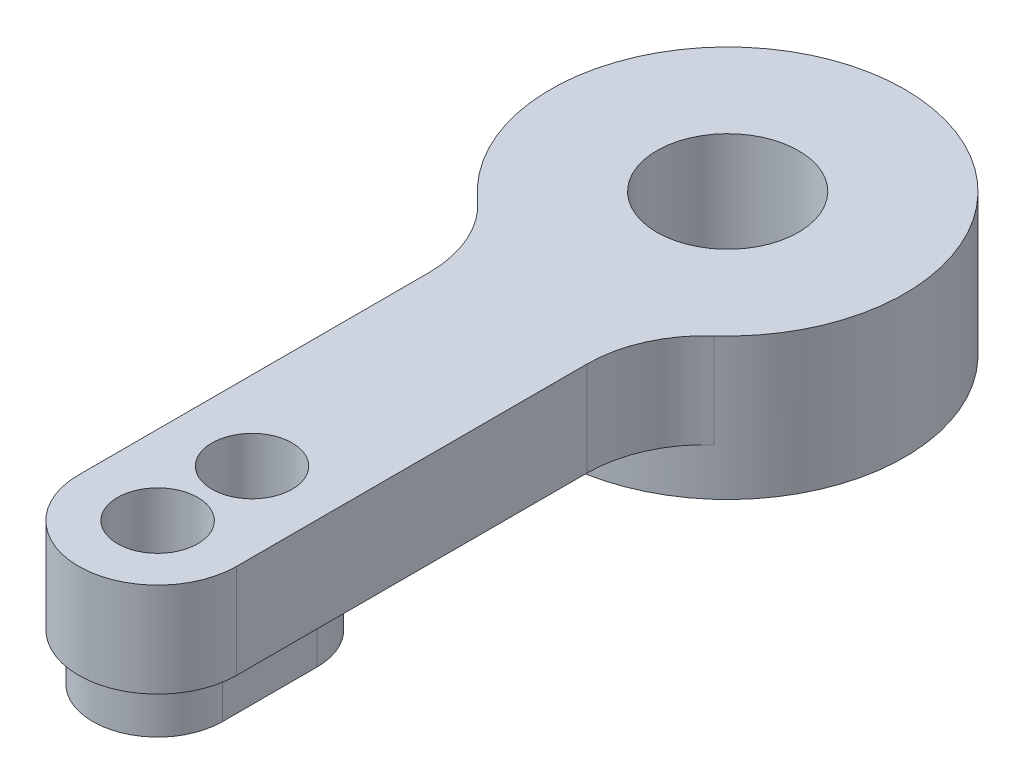
ISO-10303-21;
HEADER;
FILE_DESCRIPTION(('STEP AP214'),'2;1');
FILE_NAME('part.step','',(''),(''),'','','');
FILE_SCHEMA(('AUTOMOTIVE_DESIGN { 1 0 10303 214 1 1 1 1 }'));
ENDSEC;
DATA;
#1=APPLICATION_CONTEXT('core data for automotive mechanical design processes');
#2=APPLICATION_PROTOCOL_DEFINITION('international standard','automotive_design',2000,#1);
#3=PRODUCT_CONTEXT('',#1,'mechanical');
#4=PRODUCT('Part','Part','',(#3));
#5=PRODUCT_RELATED_PRODUCT_CATEGORY('part','',(#4));
#6=PRODUCT_DEFINITION_FORMATION('','',#4);
#7=PRODUCT_DEFINITION_CONTEXT('part definition',#1,'design');
#8=PRODUCT_DEFINITION('design','',#6,#7);
#9=PRODUCT_DEFINITION_SHAPE('','',#8);
#10=(LENGTH_UNIT() NAMED_UNIT(*) SI_UNIT(.MILLI.,.METRE.));
#11=(NAMED_UNIT(*) PLANE_ANGLE_UNIT() SI_UNIT($,.RADIAN.));
#12=(NAMED_UNIT(*) SI_UNIT($,.STERADIAN.) SOLID_ANGLE_UNIT());
#13=UNCERTAINTY_MEASURE_WITH_UNIT(LENGTH_MEASURE(1.E-05),#10,'distance_accuracy_value','');
#14=(GEOMETRIC_REPRESENTATION_CONTEXT(3) GLOBAL_UNCERTAINTY_ASSIGNED_CONTEXT((#13)) GLOBAL_UNIT_ASSIGNED_CONTEXT((#10,
#11,#12)) REPRESENTATION_CONTEXT('',''));
#15=CARTESIAN_POINT('',(0.,0.,0.));
#16=DIRECTION('',(0.,0.,1.));
#17=DIRECTION('',(1.,0.,0.));
#18=AXIS2_PLACEMENT_3D('',#15,#16,#17);
#19=CARTESIAN_POINT('',(0.,0.,24.15));
#20=DIRECTION('',(0.,1.,0.));
#21=DIRECTION('',(0.,0.,1.));
#22=AXIS2_PLACEMENT_3D('',#19,#20,#21);
#23=PLANE('',#22);
#24=CARTESIAN_POINT('',(0.,0.,20.15));
#25=DIRECTION('',(0.,-1.,0.));
#26=DIRECTION('',(0.,0.,-1.));
#27=AXIS2_PLACEMENT_3D('',#24,#25,#26);
#28=CIRCLE('',#27,1.69999999999999);
#29=CARTESIAN_POINT('',(0.,0.,18.45));
#30=VERTEX_POINT('',#29);
#31=EDGE_CURVE('E191',#30,#30,#28,.T.);
#32=ORIENTED_EDGE('',*,*,#31,.F.);
#33=EDGE_LOOP('',(#32));
#34=FACE_BOUND('',#33,.T.);
#35=CARTESIAN_POINT('',(0.,0.,24.15));
#36=DIRECTION('',(0.,-1.,0.));
#37=DIRECTION('',(0.,0.,-1.));
#38=AXIS2_PLACEMENT_3D('',#35,#36,#37);
#39=CIRCLE('',#38,1.69999999999999);
#40=CARTESIAN_POINT('',(0.,0.,22.45));
#41=VERTEX_POINT('',#40);
#42=EDGE_CURVE('E183',#41,#41,#39,.T.);
#43=ORIENTED_EDGE('',*,*,#42,.F.);
#44=EDGE_LOOP('',(#43));
#45=FACE_BOUND('',#44,.T.);
#46=CARTESIAN_POINT('',(0.,0.,24.15));
#47=DIRECTION('',(0.,-1.,0.));
#48=DIRECTION('',(0.,0.,-1.));
#49=AXIS2_PLACEMENT_3D('',#46,#47,#48);
#50=CIRCLE('',#49,2.75);
#51=CARTESIAN_POINT('',(2.75,0.,24.15));
#52=VERTEX_POINT('',#51);
#53=CARTESIAN_POINT('',(-2.75,0.,24.15));
#54=VERTEX_POINT('',#53);
#55=EDGE_CURVE('E155',#52,#54,#50,.T.);
#56=ORIENTED_EDGE('',*,*,#55,.T.);
#57=DIRECTION('',(0.,0.,-1.));
#58=VECTOR('',#57,1.);
#59=CARTESIAN_POINT('',(-2.75,0.,24.15));
#60=LINE('',#59,#58);
#61=CARTESIAN_POINT('',(-2.75,0.,20.15));
#62=VERTEX_POINT('',#61);
#63=EDGE_CURVE('E121',#54,#62,#60,.T.);
#64=ORIENTED_EDGE('',*,*,#63,.T.);
#65=CARTESIAN_POINT('',(0.,0.,20.15));
#66=DIRECTION('',(0.,-1.,0.));
#67=DIRECTION('',(0.,0.,-1.));
#68=AXIS2_PLACEMENT_3D('',#65,#66,#67);
#69=CIRCLE('',#68,2.75);
#70=CARTESIAN_POINT('',(2.75,0.,20.15));
#71=VERTEX_POINT('',#70);
#72=EDGE_CURVE('E148',#62,#71,#69,.T.);
#73=ORIENTED_EDGE('',*,*,#72,.T.);
#74=DIRECTION('',(0.,0.,1.));
#75=VECTOR('',#74,1.);
#76=CARTESIAN_POINT('',(2.75,0.,24.15));
#77=LINE('',#76,#75);
#78=EDGE_CURVE('E144',#71,#52,#77,.T.);
#79=ORIENTED_EDGE('',*,*,#78,.T.);
#80=EDGE_LOOP('',(#56,#64,#73,#79));
#81=FACE_BOUND('',#80,.T.);
#82=ADVANCED_FACE('F39',(#34,#45,#81),#23,.F.);
#83=CARTESIAN_POINT('',(0.,6.,24.15));
#84=DIRECTION('',(0.,-1.,0.));
#85=DIRECTION('',(0.,0.,-1.));
#86=AXIS2_PLACEMENT_3D('',#83,#84,#85);
#87=CYLINDRICAL_SURFACE('',#86,3.35);
#88=CARTESIAN_POINT('',(0.,2.,24.15));
#89=DIRECTION('',(0.,-1.,0.));
#90=DIRECTION('',(0.,0.,-1.));
#91=AXIS2_PLACEMENT_3D('',#88,#89,#90);
#92=CIRCLE('',#91,3.35);
#93=CARTESIAN_POINT('',(3.35,2.,24.15));
#94=VERTEX_POINT('',#93);
#95=CARTESIAN_POINT('',(-3.35,2.,24.15));
#96=VERTEX_POINT('',#95);
#97=EDGE_CURVE('E165',#94,#96,#92,.T.);
#98=ORIENTED_EDGE('',*,*,#97,.F.);
#99=DIRECTION('',(0.,-1.,0.));
#100=VECTOR('',#99,1.);
#101=CARTESIAN_POINT('',(3.35,6.,24.15));
#102=LINE('',#101,#100);
#103=CARTESIAN_POINT('',(3.35,6.,24.15));
#104=VERTEX_POINT('',#103);
#105=EDGE_CURVE('E229',#104,#94,#102,.T.);
#106=ORIENTED_EDGE('',*,*,#105,.F.);
#107=CARTESIAN_POINT('',(0.,6.,24.15));
#108=DIRECTION('',(0.,1.,0.));
#109=DIRECTION('',(0.,0.,1.));
#110=AXIS2_PLACEMENT_3D('',#107,#108,#109);
#111=CIRCLE('',#110,3.35);
#112=CARTESIAN_POINT('',(-3.35,6.,24.15));
#113=VERTEX_POINT('',#112);
#114=EDGE_CURVE('E208',#113,#104,#111,.T.);
#115=ORIENTED_EDGE('',*,*,#114,.F.);
#116=DIRECTION('',(0.,-1.,0.));
#117=VECTOR('',#116,1.);
#118=CARTESIAN_POINT('',(-3.35,6.,24.15));
#119=LINE('',#118,#117);
#120=EDGE_CURVE('E222',#113,#96,#119,.T.);
#121=ORIENTED_EDGE('',*,*,#120,.T.);
#122=EDGE_LOOP('',(#98,#106,#115,#121));
#123=FACE_BOUND('',#122,.T.);
#124=ADVANCED_FACE('F270',(#123),#87,.T.);
#125=CARTESIAN_POINT('',(3.35,6.,24.15));
#126=DIRECTION('',(-1.,0.,0.));
#127=DIRECTION('',(0.,0.,1.));
#128=AXIS2_PLACEMENT_3D('',#125,#126,#127);
#129=PLANE('',#128);
#130=DIRECTION('',(0.,0.,1.));
#131=VECTOR('',#130,1.);
#132=CARTESIAN_POINT('',(3.35,2.,24.15));
#133=LINE('',#132,#131);
#134=CARTESIAN_POINT('',(3.35,2.,9.30201591054327));
#135=VERTEX_POINT('',#134);
#136=EDGE_CURVE('E180',#135,#94,#133,.T.);
#137=ORIENTED_EDGE('',*,*,#136,.F.);
#138=DIRECTION('',(0.,1.,0.));
#139=VECTOR('',#138,1.);
#140=CARTESIAN_POINT('',(3.35,6.,9.30201591054327));
#141=LINE('',#140,#139);
#142=CARTESIAN_POINT('',(3.35,6.,9.30201591054327));
#143=VERTEX_POINT('',#142);
#144=EDGE_CURVE('E55',#135,#143,#141,.T.);
#145=ORIENTED_EDGE('',*,*,#144,.T.);
#146=DIRECTION('',(0.,0.,-1.));
#147=VECTOR('',#146,1.);
#148=CARTESIAN_POINT('',(3.35,6.,24.15));
#149=LINE('',#148,#147);
#150=EDGE_CURVE('E212',#104,#143,#149,.T.);
#151=ORIENTED_EDGE('',*,*,#150,.F.);
#152=ORIENTED_EDGE('',*,*,#105,.T.);
#153=EDGE_LOOP('',(#137,#145,#151,#152));
#154=FACE_BOUND('',#153,.T.);
#155=ADVANCED_FACE('F298',(#154),#129,.F.);
#156=CARTESIAN_POINT('',(-3.35,6.,24.15));
#157=DIRECTION('',(1.,0.,0.));
#158=DIRECTION('',(0.,0.,-1.));
#159=AXIS2_PLACEMENT_3D('',#156,#157,#158);
#160=PLANE('',#159);
#161=DIRECTION('',(0.,0.,1.));
#162=VECTOR('',#161,1.);
#163=CARTESIAN_POINT('',(-3.35,6.,24.15));
#164=LINE('',#163,#162);
#165=CARTESIAN_POINT('',(-3.35,6.,9.30201591054327));
#166=VERTEX_POINT('',#165);
#167=EDGE_CURVE('E219',#166,#113,#164,.T.);
#168=ORIENTED_EDGE('',*,*,#167,.F.);
#169=DIRECTION('',(0.,1.,0.));
#170=VECTOR('',#169,1.);
#171=CARTESIAN_POINT('',(-3.35,2.,9.30201591054327));
#172=LINE('',#171,#170);
#173=CARTESIAN_POINT('',(-3.35,2.,9.30201591054327));
#174=VERTEX_POINT('',#173);
#175=EDGE_CURVE('E233',#166,#174,#172,.F.);
#176=ORIENTED_EDGE('',*,*,#175,.T.);
#177=DIRECTION('',(0.,0.,-1.));
#178=VECTOR('',#177,1.);
#179=CARTESIAN_POINT('',(-3.35,2.,24.15));
#180=LINE('',#179,#178);
#181=EDGE_CURVE('E173',#96,#174,#180,.T.);
#182=ORIENTED_EDGE('',*,*,#181,.F.);
#183=ORIENTED_EDGE('',*,*,#120,.F.);
#184=EDGE_LOOP('',(#168,#176,#182,#183));
#185=FACE_BOUND('',#184,.T.);
#186=ADVANCED_FACE('F264',(#185),#160,.F.);
#187=CARTESIAN_POINT('',(0.,6.,24.15));
#188=DIRECTION('',(0.,1.,0.));
#189=DIRECTION('',(0.,0.,1.));
#190=AXIS2_PLACEMENT_3D('',#187,#188,#189);
#191=PLANE('',#190);
#192=CARTESIAN_POINT('',(0.,6.,24.15));
#193=DIRECTION('',(0.,-1.,0.));
#194=DIRECTION('',(0.,0.,-1.));
#195=AXIS2_PLACEMENT_3D('',#192,#193,#194);
#196=CIRCLE('',#195,1.7);
#197=CARTESIAN_POINT('',(0.,6.,22.45));
#198=VERTEX_POINT('',#197);
#199=EDGE_CURVE('E187',#198,#198,#196,.T.);
#200=ORIENTED_EDGE('',*,*,#199,.T.);
#201=EDGE_LOOP('',(#200));
#202=FACE_BOUND('',#201,.T.);
#203=CARTESIAN_POINT('',(0.,6.,20.15));
#204=DIRECTION('',(0.,-1.,0.));
#205=DIRECTION('',(0.,0.,-1.));
#206=AXIS2_PLACEMENT_3D('',#203,#204,#205);
#207=CIRCLE('',#206,1.7);
#208=CARTESIAN_POINT('',(0.,6.,18.45));
#209=VERTEX_POINT('',#208);
#210=EDGE_CURVE('E195',#209,#209,#207,.T.);
#211=ORIENTED_EDGE('',*,*,#210,.T.);
#212=EDGE_LOOP('',(#211));
#213=FACE_BOUND('',#212,.T.);
#214=ORIENTED_EDGE('',*,*,#114,.T.);
#215=ORIENTED_EDGE('',*,*,#150,.T.);
#216=CARTESIAN_POINT('',(8.34999999999999,6.,9.30201591054327));
#217=DIRECTION('',(0.,1.,0.));
#218=DIRECTION('',(0.,0.,1.));
#219=AXIS2_PLACEMENT_3D('',#216,#217,#218);
#220=CIRCLE('',#219,5.);
#221=CARTESIAN_POINT('',(5.01,6.,5.58120954632596));
#222=VERTEX_POINT('',#221);
#223=EDGE_CURVE('E11',#143,#222,#220,.F.);
#224=ORIENTED_EDGE('',*,*,#223,.T.);
#225=CARTESIAN_POINT('',(0.,6.,0.));
#226=DIRECTION('',(0.,1.,0.));
#227=DIRECTION('',(0.,0.,1.));
#228=AXIS2_PLACEMENT_3D('',#225,#226,#227);
#229=CIRCLE('',#228,7.5);
#230=CARTESIAN_POINT('',(-5.01,6.,5.58120954632596));
#231=VERTEX_POINT('',#230);
#232=EDGE_CURVE('E215',#222,#231,#229,.T.);
#233=ORIENTED_EDGE('',*,*,#232,.T.);
#234=CARTESIAN_POINT('',(-8.34999999999999,6.,9.30201591054327));
#235=DIRECTION('',(0.,1.,0.));
#236=DIRECTION('',(0.,0.,1.));
#237=AXIS2_PLACEMENT_3D('',#234,#235,#236);
#238=CIRCLE('',#237,5.);
#239=EDGE_CURVE('E250',#231,#166,#238,.F.);
#240=ORIENTED_EDGE('',*,*,#239,.T.);
#241=ORIENTED_EDGE('',*,*,#167,.T.);
#242=EDGE_LOOP('',(#214,#215,#224,#233,#240,#241));
#243=FACE_BOUND('',#242,.T.);
#244=CARTESIAN_POINT('',(0.,6.,0.));
#245=DIRECTION('',(0.,1.,0.));
#246=DIRECTION('',(0.,0.,1.));
#247=AXIS2_PLACEMENT_3D('',#244,#245,#246);
#248=CIRCLE('',#247,3.);
#249=CARTESIAN_POINT('',(0.,6.,3.));
#250=VERTEX_POINT('',#249);
#251=EDGE_CURVE('E200',#250,#250,#248,.T.);
#252=ORIENTED_EDGE('',*,*,#251,.F.);
#253=EDGE_LOOP('',(#252));
#254=FACE_BOUND('',#253,.T.);
#255=ADVANCED_FACE('F256',(#202,#213,#243,#254),#191,.T.);
#256=CARTESIAN_POINT('',(0.,0.,0.));
#257=DIRECTION('',(0.,1.,0.));
#258=DIRECTION('',(0.,0.,1.));
#259=AXIS2_PLACEMENT_3D('',#256,#257,#258);
#260=CIRCLE('',#259,7.5);
#261=CARTESIAN_POINT('',(0.,0.,7.5));
#262=VERTEX_POINT('',#261);
#263=EDGE_CURVE('E204',#262,#262,#260,.T.);
#264=ORIENTED_EDGE('',*,*,#263,.F.);
#265=EDGE_LOOP('',(#264));
#266=FACE_BOUND('',#265,.T.);
#267=CARTESIAN_POINT('',(0.,0.,0.));
#268=DIRECTION('',(0.,1.,0.));
#269=DIRECTION('',(0.,0.,1.));
#270=AXIS2_PLACEMENT_3D('',#267,#268,#269);
#271=CIRCLE('',#270,3.);
#272=CARTESIAN_POINT('',(0.,0.,3.));
#273=VERTEX_POINT('',#272);
#274=EDGE_CURVE('E199',#273,#273,#271,.T.);
#275=ORIENTED_EDGE('',*,*,#274,.T.);
#276=EDGE_LOOP('',(#275));
#277=FACE_BOUND('',#276,.T.);
#278=ADVANCED_FACE('F279',(#266,#277),#23,.F.);
#279=CARTESIAN_POINT('',(0.,6.,0.));
#280=DIRECTION('',(0.,-1.,0.));
#281=DIRECTION('',(0.,0.,-1.));
#282=AXIS2_PLACEMENT_3D('',#279,#280,#281);
#283=CYLINDRICAL_SURFACE('',#282,7.5);
#284=ORIENTED_EDGE('',*,*,#263,.T.);
#285=EDGE_LOOP('',(#284));
#286=FACE_BOUND('',#285,.T.);
#287=CARTESIAN_POINT('',(0.,2.,0.));
#288=DIRECTION('',(0.,1.,0.));
#289=DIRECTION('',(0.,0.,-1.));
#290=AXIS2_PLACEMENT_3D('',#287,#288,#289);
#291=CIRCLE('',#290,7.5);
#292=CARTESIAN_POINT('',(-5.01,2.,5.58120954632596));
#293=VERTEX_POINT('',#292);
#294=CARTESIAN_POINT('',(5.01,2.,5.58120954632596));
#295=VERTEX_POINT('',#294);
#296=EDGE_CURVE('E177',#293,#295,#291,.T.);
#297=ORIENTED_EDGE('',*,*,#296,.F.);
#298=DIRECTION('',(0.,-1.,0.));
#299=VECTOR('',#298,1.);
#300=CARTESIAN_POINT('',(-5.01,6.,5.58120954632596));
#301=LINE('',#300,#299);
#302=EDGE_CURVE('E241',#293,#231,#301,.F.);
#303=ORIENTED_EDGE('',*,*,#302,.T.);
#304=ORIENTED_EDGE('',*,*,#232,.F.);
#305=DIRECTION('',(0.,-1.,0.));
#306=VECTOR('',#305,1.);
#307=CARTESIAN_POINT('',(5.01,6.,5.58120954632596));
#308=LINE('',#307,#306);
#309=EDGE_CURVE('E237',#222,#295,#308,.T.);
#310=ORIENTED_EDGE('',*,*,#309,.T.);
#311=EDGE_LOOP('',(#297,#303,#304,#310));
#312=FACE_BOUND('',#311,.T.);
#313=ADVANCED_FACE('F276',(#286,#312),#283,.T.);
#314=CARTESIAN_POINT('',(0.,6.,0.));
#315=DIRECTION('',(0.,-1.,0.));
#316=DIRECTION('',(0.,0.,-1.));
#317=AXIS2_PLACEMENT_3D('',#314,#315,#316);
#318=CYLINDRICAL_SURFACE('',#317,3.);
#319=ORIENTED_EDGE('',*,*,#251,.T.);
#320=EDGE_LOOP('',(#319));
#321=FACE_BOUND('',#320,.T.);
#322=ORIENTED_EDGE('',*,*,#274,.F.);
#323=EDGE_LOOP('',(#322));
#324=FACE_BOUND('',#323,.T.);
#325=ADVANCED_FACE('F278',(#321,#324),#318,.F.);
#326=CARTESIAN_POINT('',(0.,0.,20.15));
#327=DIRECTION('',(0.,-1.,0.));
#328=DIRECTION('',(0.,0.,-1.));
#329=AXIS2_PLACEMENT_3D('',#326,#327,#328);
#330=CYLINDRICAL_SURFACE('',#329,1.69999999999999);
#331=ORIENTED_EDGE('',*,*,#210,.F.);
#332=EDGE_LOOP('',(#331));
#333=FACE_BOUND('',#332,.T.);
#334=ORIENTED_EDGE('',*,*,#31,.T.);
#335=EDGE_LOOP('',(#334));
#336=FACE_BOUND('',#335,.T.);
#337=ADVANCED_FACE('F286',(#333,#336),#330,.F.);
#338=CARTESIAN_POINT('',(0.,0.,24.15));
#339=DIRECTION('',(0.,-1.,0.));
#340=DIRECTION('',(0.,0.,-1.));
#341=AXIS2_PLACEMENT_3D('',#338,#339,#340);
#342=CYLINDRICAL_SURFACE('',#341,1.69999999999999);
#343=ORIENTED_EDGE('',*,*,#199,.F.);
#344=EDGE_LOOP('',(#343));
#345=FACE_BOUND('',#344,.T.);
#346=ORIENTED_EDGE('',*,*,#42,.T.);
#347=EDGE_LOOP('',(#346));
#348=FACE_BOUND('',#347,.T.);
#349=ADVANCED_FACE('F330',(#345,#348),#342,.F.);
#350=CARTESIAN_POINT('',(0.,2.,24.15));
#351=DIRECTION('',(0.,-1.,0.));
#352=DIRECTION('',(0.,0.,-1.));
#353=AXIS2_PLACEMENT_3D('',#350,#351,#352);
#354=PLANE('',#353);
#355=DIRECTION('',(0.,0.,1.));
#356=VECTOR('',#355,1.);
#357=CARTESIAN_POINT('',(2.75,2.,24.15));
#358=LINE('',#357,#356);
#359=CARTESIAN_POINT('',(2.75,2.,20.15));
#360=VERTEX_POINT('',#359);
#361=CARTESIAN_POINT('',(2.75,2.,24.15));
#362=VERTEX_POINT('',#361);
#363=EDGE_CURVE('E128',#360,#362,#358,.T.);
#364=ORIENTED_EDGE('',*,*,#363,.F.);
#365=CARTESIAN_POINT('',(0.,2.,20.15));
#366=DIRECTION('',(0.,-1.,0.));
#367=DIRECTION('',(0.,0.,-1.));
#368=AXIS2_PLACEMENT_3D('',#365,#366,#367);
#369=CIRCLE('',#368,2.75);
#370=CARTESIAN_POINT('',(-2.75,2.,20.15));
#371=VERTEX_POINT('',#370);
#372=EDGE_CURVE('E137',#371,#360,#369,.T.);
#373=ORIENTED_EDGE('',*,*,#372,.F.);
#374=DIRECTION('',(0.,0.,-1.));
#375=VECTOR('',#374,1.);
#376=CARTESIAN_POINT('',(-2.75,2.,24.15));
#377=LINE('',#376,#375);
#378=CARTESIAN_POINT('',(-2.75,2.,24.15));
#379=VERTEX_POINT('',#378);
#380=EDGE_CURVE('E119',#379,#371,#377,.T.);
#381=ORIENTED_EDGE('',*,*,#380,.F.);
#382=CARTESIAN_POINT('',(0.,2.,24.15));
#383=DIRECTION('',(0.,-1.,0.));
#384=DIRECTION('',(0.,0.,-1.));
#385=AXIS2_PLACEMENT_3D('',#382,#383,#384);
#386=CIRCLE('',#385,2.75);
#387=EDGE_CURVE('E134',#362,#379,#386,.T.);
#388=ORIENTED_EDGE('',*,*,#387,.F.);
#389=EDGE_LOOP('',(#364,#373,#381,#388));
#390=FACE_BOUND('',#389,.T.);
#391=ORIENTED_EDGE('',*,*,#97,.T.);
#392=ORIENTED_EDGE('',*,*,#181,.T.);
#393=CARTESIAN_POINT('',(-8.34999999999999,2.,9.30201591054327));
#394=DIRECTION('',(0.,-1.,0.));
#395=DIRECTION('',(0.,0.,-1.));
#396=AXIS2_PLACEMENT_3D('',#393,#394,#395);
#397=CIRCLE('',#396,5.);
#398=EDGE_CURVE('E246',#174,#293,#397,.F.);
#399=ORIENTED_EDGE('',*,*,#398,.T.);
#400=ORIENTED_EDGE('',*,*,#296,.T.);
#401=CARTESIAN_POINT('',(8.34999999999999,2.,9.30201591054327));
#402=DIRECTION('',(0.,-1.,0.));
#403=DIRECTION('',(0.,0.,-1.));
#404=AXIS2_PLACEMENT_3D('',#401,#402,#403);
#405=CIRCLE('',#404,5.);
#406=EDGE_CURVE('E48',#295,#135,#405,.F.);
#407=ORIENTED_EDGE('',*,*,#406,.T.);
#408=ORIENTED_EDGE('',*,*,#136,.T.);
#409=EDGE_LOOP('',(#391,#392,#399,#400,#407,#408));
#410=FACE_BOUND('',#409,.T.);
#411=ADVANCED_FACE('F133',(#390,#410),#354,.T.);
#412=CARTESIAN_POINT('',(0.,2.,24.15));
#413=DIRECTION('',(0.,-1.,0.));
#414=DIRECTION('',(0.,0.,-1.));
#415=AXIS2_PLACEMENT_3D('',#412,#413,#414);
#416=CYLINDRICAL_SURFACE('',#415,2.75);
#417=ORIENTED_EDGE('',*,*,#55,.F.);
#418=DIRECTION('',(0.,-1.,0.));
#419=VECTOR('',#418,1.);
#420=CARTESIAN_POINT('',(2.75,2.,24.15));
#421=LINE('',#420,#419);
#422=EDGE_CURVE('E142',#362,#52,#421,.T.);
#423=ORIENTED_EDGE('',*,*,#422,.F.);
#424=ORIENTED_EDGE('',*,*,#387,.T.);
#425=DIRECTION('',(0.,-1.,0.));
#426=VECTOR('',#425,1.);
#427=CARTESIAN_POINT('',(-2.75,2.,24.15));
#428=LINE('',#427,#426);
#429=EDGE_CURVE('E115',#379,#54,#428,.T.);
#430=ORIENTED_EDGE('',*,*,#429,.T.);
#431=EDGE_LOOP('',(#417,#423,#424,#430));
#432=FACE_BOUND('',#431,.T.);
#433=ADVANCED_FACE('F141',(#432),#416,.T.);
#434=CARTESIAN_POINT('',(2.75,2.,24.15));
#435=DIRECTION('',(1.,0.,0.));
#436=DIRECTION('',(0.,0.,-1.));
#437=AXIS2_PLACEMENT_3D('',#434,#435,#436);
#438=PLANE('',#437);
#439=ORIENTED_EDGE('',*,*,#78,.F.);
#440=DIRECTION('',(0.,-1.,0.));
#441=VECTOR('',#440,1.);
#442=CARTESIAN_POINT('',(2.75,2.,20.15));
#443=LINE('',#442,#441);
#444=EDGE_CURVE('E166',#360,#71,#443,.T.);
#445=ORIENTED_EDGE('',*,*,#444,.F.);
#446=ORIENTED_EDGE('',*,*,#363,.T.);
#447=ORIENTED_EDGE('',*,*,#422,.T.);
#448=EDGE_LOOP('',(#439,#445,#446,#447));
#449=FACE_BOUND('',#448,.T.);
#450=ADVANCED_FACE('F321',(#449),#438,.T.);
#451=CARTESIAN_POINT('',(0.,2.,20.15));
#452=DIRECTION('',(0.,-1.,0.));
#453=DIRECTION('',(0.,0.,-1.));
#454=AXIS2_PLACEMENT_3D('',#451,#452,#453);
#455=CYLINDRICAL_SURFACE('',#454,2.75);
#456=ORIENTED_EDGE('',*,*,#72,.F.);
#457=DIRECTION('',(0.,-1.,0.));
#458=VECTOR('',#457,1.);
#459=CARTESIAN_POINT('',(-2.75,2.,20.15));
#460=LINE('',#459,#458);
#461=EDGE_CURVE('E127',#371,#62,#460,.T.);
#462=ORIENTED_EDGE('',*,*,#461,.F.);
#463=ORIENTED_EDGE('',*,*,#372,.T.);
#464=ORIENTED_EDGE('',*,*,#444,.T.);
#465=EDGE_LOOP('',(#456,#462,#463,#464));
#466=FACE_BOUND('',#465,.T.);
#467=ADVANCED_FACE('F316',(#466),#455,.T.);
#468=CARTESIAN_POINT('',(-2.75,2.,24.15));
#469=DIRECTION('',(-1.,0.,0.));
#470=DIRECTION('',(0.,0.,1.));
#471=AXIS2_PLACEMENT_3D('',#468,#469,#470);
#472=PLANE('',#471);
#473=ORIENTED_EDGE('',*,*,#63,.F.);
#474=ORIENTED_EDGE('',*,*,#429,.F.);
#475=ORIENTED_EDGE('',*,*,#380,.T.);
#476=ORIENTED_EDGE('',*,*,#461,.T.);
#477=EDGE_LOOP('',(#473,#474,#475,#476));
#478=FACE_BOUND('',#477,.T.);
#479=ADVANCED_FACE('F117',(#478),#472,.T.);
#480=CARTESIAN_POINT('',(-8.34999999999999,6.,9.30201591054327));
#481=DIRECTION('',(0.,-1.,0.));
#482=DIRECTION('',(0.,0.,-1.));
#483=AXIS2_PLACEMENT_3D('',#480,#481,#482);
#484=CYLINDRICAL_SURFACE('',#483,5.);
#485=ORIENTED_EDGE('',*,*,#239,.F.);
#486=ORIENTED_EDGE('',*,*,#302,.F.);
#487=ORIENTED_EDGE('',*,*,#398,.F.);
#488=ORIENTED_EDGE('',*,*,#175,.F.);
#489=EDGE_LOOP('',(#485,#486,#487,#488));
#490=FACE_BOUND('',#489,.T.);
#491=ADVANCED_FACE('F267',(#490),#484,.F.);
#492=CARTESIAN_POINT('',(8.34999999999999,6.,9.30201591054327));
#493=DIRECTION('',(0.,-1.,0.));
#494=DIRECTION('',(0.,0.,-1.));
#495=AXIS2_PLACEMENT_3D('',#492,#493,#494);
#496=CYLINDRICAL_SURFACE('',#495,5.);
#497=ORIENTED_EDGE('',*,*,#223,.F.);
#498=ORIENTED_EDGE('',*,*,#144,.F.);
#499=ORIENTED_EDGE('',*,*,#406,.F.);
#500=ORIENTED_EDGE('',*,*,#309,.F.);
#501=EDGE_LOOP('',(#497,#498,#499,#500));
#502=FACE_BOUND('',#501,.T.);
#503=ADVANCED_FACE('F41',(#502),#496,.F.);
#504=CLOSED_SHELL('',(#82,#124,#155,#186,#255,#278,#313,#325,#337,#349,#411,#433,#450,#467,#479,
#491,#503));
#505=MANIFOLD_SOLID_BREP('B2',#504);
#506=ADVANCED_BREP_SHAPE_REPRESENTATION('',(#18,#505),#14);
#507=SHAPE_DEFINITION_REPRESENTATION(#9,#506);
ENDSEC;
END-ISO-10303-21;
